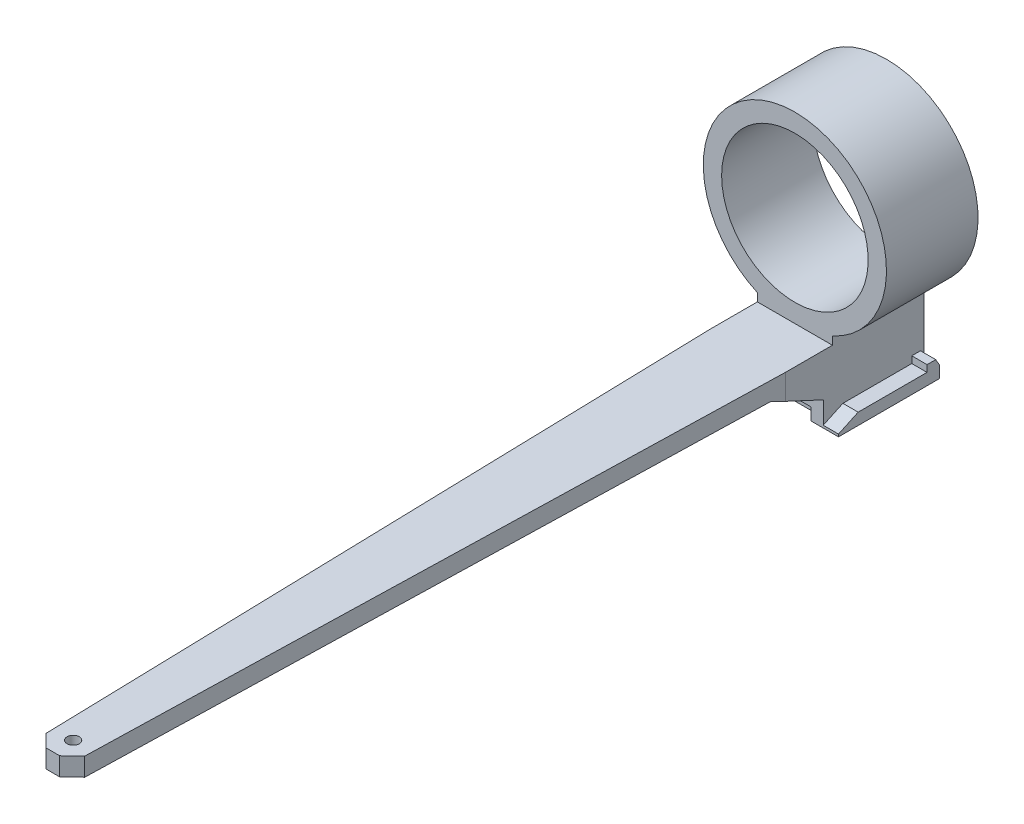
ISO-10303-21;
HEADER;
FILE_DESCRIPTION(('STEP AP214'),'2;1');
FILE_NAME('part.step','',(''),(''),'','','');
FILE_SCHEMA(('AUTOMOTIVE_DESIGN { 1 0 10303 214 1 1 1 1 }'));
ENDSEC;
DATA;
#1=APPLICATION_CONTEXT('core data for automotive mechanical design processes');
#2=APPLICATION_PROTOCOL_DEFINITION('international standard','automotive_design',2000,#1);
#3=PRODUCT_CONTEXT('',#1,'mechanical');
#4=PRODUCT('Part','Part','',(#3));
#5=PRODUCT_RELATED_PRODUCT_CATEGORY('part','',(#4));
#6=PRODUCT_DEFINITION_FORMATION('','',#4);
#7=PRODUCT_DEFINITION_CONTEXT('part definition',#1,'design');
#8=PRODUCT_DEFINITION('design','',#6,#7);
#9=PRODUCT_DEFINITION_SHAPE('','',#8);
#10=(LENGTH_UNIT() NAMED_UNIT(*) SI_UNIT(.MILLI.,.METRE.));
#11=(NAMED_UNIT(*) PLANE_ANGLE_UNIT() SI_UNIT($,.RADIAN.));
#12=(NAMED_UNIT(*) SI_UNIT($,.STERADIAN.) SOLID_ANGLE_UNIT());
#13=UNCERTAINTY_MEASURE_WITH_UNIT(LENGTH_MEASURE(1.E-05),#10,'distance_accuracy_value','');
#14=(GEOMETRIC_REPRESENTATION_CONTEXT(3) GLOBAL_UNCERTAINTY_ASSIGNED_CONTEXT((#13)) GLOBAL_UNIT_ASSIGNED_CONTEXT((#10,
#11,#12)) REPRESENTATION_CONTEXT('',''));
#15=CARTESIAN_POINT('',(0.,0.,0.));
#16=DIRECTION('',(0.,0.,1.));
#17=DIRECTION('',(1.,0.,0.));
#18=AXIS2_PLACEMENT_3D('',#15,#16,#17);
#19=CARTESIAN_POINT('',(0.,3.,-15.1420124759084));
#20=DIRECTION('',(0.,0.499999999999998,-0.86602540378444));
#21=DIRECTION('',(1.,0.,0.));
#22=AXIS2_PLACEMENT_3D('',#19,#20,#21);
#23=PLANE('',#22);
#24=DIRECTION('',(0.,0.86602540378444,0.499999999999998));
#25=VECTOR('',#24,1.);
#26=CARTESIAN_POINT('',(-14.0065823958615,3.,-15.1420124759084));
#27=LINE('',#26,#25);
#28=CARTESIAN_POINT('',(-14.0065823958615,2.,-15.719362745098));
#29=VERTEX_POINT('',#28);
#30=CARTESIAN_POINT('',(-14.0065823958615,3.,-15.1420124759084));
#31=VERTEX_POINT('',#30);
#32=EDGE_CURVE('E392',#29,#31,#27,.T.);
#33=ORIENTED_EDGE('',*,*,#32,.F.);
#34=DIRECTION('',(1.,0.,0.));
#35=VECTOR('',#34,1.);
#36=CARTESIAN_POINT('',(0.786356209150324,2.,-15.719362745098));
#37=LINE('',#36,#35);
#38=CARTESIAN_POINT('',(-16.7136437908497,2.,-15.719362745098));
#39=VERTEX_POINT('',#38);
#40=EDGE_CURVE('E432',#39,#29,#37,.T.);
#41=ORIENTED_EDGE('',*,*,#40,.F.);
#42=DIRECTION('',(0.,-0.86602540378444,-0.499999999999998));
#43=VECTOR('',#42,1.);
#44=CARTESIAN_POINT('',(-16.7136437908497,3.,-15.1420124759084));
#45=LINE('',#44,#43);
#46=CARTESIAN_POINT('',(-16.7136437908497,3.,-15.1420124759084));
#47=VERTEX_POINT('',#46);
#48=EDGE_CURVE('E514',#47,#39,#45,.T.);
#49=ORIENTED_EDGE('',*,*,#48,.F.);
#50=DIRECTION('',(-1.,0.,0.));
#51=VECTOR('',#50,1.);
#52=CARTESIAN_POINT('',(-16.7136437908497,3.,-15.1420124759084));
#53=LINE('',#52,#51);
#54=EDGE_CURVE('E436',#31,#47,#53,.T.);
#55=ORIENTED_EDGE('',*,*,#54,.F.);
#56=EDGE_LOOP('',(#33,#41,#49,#55));
#57=FACE_BOUND('',#56,.T.);
#58=ADVANCED_FACE('F33',(#57),#23,.T.);
#59=CARTESIAN_POINT('',(-16.7136437908497,3.,0.780637254901961));
#60=DIRECTION('',(0.,0.,-1.));
#61=DIRECTION('',(-1.,0.,0.));
#62=AXIS2_PLACEMENT_3D('',#59,#60,#61);
#63=PLANE('',#62);
#64=DIRECTION('',(1.,0.,0.));
#65=VECTOR('',#64,1.);
#66=CARTESIAN_POINT('',(-16.7136437908497,0.,0.780637254901961));
#67=LINE('',#66,#65);
#68=CARTESIAN_POINT('',(-16.7136437908497,0.,0.780637254901961));
#69=VERTEX_POINT('',#68);
#70=CARTESIAN_POINT('',(-12.0065823958615,0.,0.780637254901961));
#71=VERTEX_POINT('',#70);
#72=EDGE_CURVE('E478',#69,#71,#67,.T.);
#73=ORIENTED_EDGE('',*,*,#72,.T.);
#74=DIRECTION('',(0.,-1.,0.));
#75=VECTOR('',#74,1.);
#76=CARTESIAN_POINT('',(-12.0065823958615,0.,0.780637254901961));
#77=LINE('',#76,#75);
#78=CARTESIAN_POINT('',(-12.0065823958615,2.,0.780637254901961));
#79=VERTEX_POINT('',#78);
#80=EDGE_CURVE('E904',#79,#71,#77,.T.);
#81=ORIENTED_EDGE('',*,*,#80,.F.);
#82=DIRECTION('',(-1.,0.,0.));
#83=VECTOR('',#82,1.);
#84=CARTESIAN_POINT('',(-12.0065823958615,2.,0.780637254901961));
#85=LINE('',#84,#83);
#86=CARTESIAN_POINT('',(-3.71364379084967,2.,0.780637254901961));
#87=VERTEX_POINT('',#86);
#88=EDGE_CURVE('E900',#87,#79,#85,.T.);
#89=ORIENTED_EDGE('',*,*,#88,.F.);
#90=DIRECTION('',(0.,1.,0.));
#91=VECTOR('',#90,1.);
#92=CARTESIAN_POINT('',(-3.71364379084967,0.,0.780637254901961));
#93=LINE('',#92,#91);
#94=CARTESIAN_POINT('',(-3.71364379084967,0.,0.780637254901961));
#95=VERTEX_POINT('',#94);
#96=EDGE_CURVE('E902',#95,#87,#93,.T.);
#97=ORIENTED_EDGE('',*,*,#96,.F.);
#98=CARTESIAN_POINT('',(0.786356209150326,0.,0.780637254901961));
#99=VERTEX_POINT('',#98);
#100=EDGE_CURVE('E245',#95,#99,#67,.T.);
#101=ORIENTED_EDGE('',*,*,#100,.T.);
#102=DIRECTION('',(0.,-1.,0.));
#103=VECTOR('',#102,1.);
#104=CARTESIAN_POINT('',(0.786356209150326,3.,0.780637254901961));
#105=LINE('',#104,#103);
#106=CARTESIAN_POINT('',(0.786356209150326,0.399999999999995,0.780637254901961));
#107=VERTEX_POINT('',#106);
#108=EDGE_CURVE('E489',#107,#99,#105,.T.);
#109=ORIENTED_EDGE('',*,*,#108,.F.);
#110=DIRECTION('',(-1.,0.,0.));
#111=VECTOR('',#110,1.);
#112=CARTESIAN_POINT('',(-16.7136437908497,0.399999999999994,0.780637254901961));
#113=LINE('',#112,#111);
#114=CARTESIAN_POINT('',(-1.71364379084967,0.399999999999995,0.780637254901961));
#115=VERTEX_POINT('',#114);
#116=EDGE_CURVE('E501',#107,#115,#113,.T.);
#117=ORIENTED_EDGE('',*,*,#116,.T.);
#118=DIRECTION('',(0.,-1.,0.));
#119=VECTOR('',#118,1.);
#120=CARTESIAN_POINT('',(-1.71364379084967,3.,0.780637254901961));
#121=LINE('',#120,#119);
#122=CARTESIAN_POINT('',(-1.71364379084967,4.,0.780637254901961));
#123=VERTEX_POINT('',#122);
#124=EDGE_CURVE('E312',#123,#115,#121,.T.);
#125=ORIENTED_EDGE('',*,*,#124,.F.);
#126=DIRECTION('',(-1.,0.,0.));
#127=VECTOR('',#126,1.);
#128=CARTESIAN_POINT('',(-14.0065823958615,4.,0.780637254901961));
#129=LINE('',#128,#127);
#130=CARTESIAN_POINT('',(-14.0065823958615,4.,0.780637254901961));
#131=VERTEX_POINT('',#130);
#132=EDGE_CURVE('E343',#123,#131,#129,.T.);
#133=ORIENTED_EDGE('',*,*,#132,.T.);
#134=DIRECTION('',(0.,1.,0.));
#135=VECTOR('',#134,1.);
#136=CARTESIAN_POINT('',(-14.0065823958615,3.,0.780637254901961));
#137=LINE('',#136,#135);
#138=CARTESIAN_POINT('',(-14.0065823958615,0.399999999999996,0.780637254901961));
#139=VERTEX_POINT('',#138);
#140=EDGE_CURVE('E354',#139,#131,#137,.T.);
#141=ORIENTED_EDGE('',*,*,#140,.F.);
#142=DIRECTION('',(-1.,0.,0.));
#143=VECTOR('',#142,1.);
#144=CARTESIAN_POINT('',(-16.7136437908497,0.399999999999996,0.780637254901961));
#145=LINE('',#144,#143);
#146=CARTESIAN_POINT('',(-16.7136437908497,0.399999999999995,0.780637254901961));
#147=VERTEX_POINT('',#146);
#148=EDGE_CURVE('E499',#139,#147,#145,.T.);
#149=ORIENTED_EDGE('',*,*,#148,.T.);
#150=DIRECTION('',(0.,-1.,0.));
#151=VECTOR('',#150,1.);
#152=CARTESIAN_POINT('',(-16.7136437908497,3.,0.780637254901961));
#153=LINE('',#152,#151);
#154=EDGE_CURVE('E492',#147,#69,#153,.T.);
#155=ORIENTED_EDGE('',*,*,#154,.T.);
#156=EDGE_LOOP('',(#73,#81,#89,#97,#101,#109,#117,#125,#133,#141,#149,#155));
#157=FACE_BOUND('',#156,.T.);
#158=ADVANCED_FACE('F568',(#157),#63,.F.);
#159=CARTESIAN_POINT('',(0.,3.,0.));
#160=DIRECTION('',(0.,1.,0.));
#161=DIRECTION('',(0.,0.,1.));
#162=AXIS2_PLACEMENT_3D('',#159,#160,#161);
#163=PLANE('',#162);
#164=DIRECTION('',(0.,0.,1.));
#165=VECTOR('',#164,1.);
#166=CARTESIAN_POINT('',(-14.0065823958615,3.,0.780637254901961));
#167=LINE('',#166,#165);
#168=CARTESIAN_POINT('',(-14.0065823958615,3.,-13.719362745098));
#169=VERTEX_POINT('',#168);
#170=EDGE_CURVE('E322',#31,#169,#167,.T.);
#171=ORIENTED_EDGE('',*,*,#170,.F.);
#172=ORIENTED_EDGE('',*,*,#54,.T.);
#173=DIRECTION('',(0.,0.,1.));
#174=VECTOR('',#173,1.);
#175=CARTESIAN_POINT('',(-16.7136437908497,3.,-15.719362745098));
#176=LINE('',#175,#174);
#177=CARTESIAN_POINT('',(-16.7136437908497,3.,-13.719362745098));
#178=VERTEX_POINT('',#177);
#179=EDGE_CURVE('E469',#47,#178,#176,.T.);
#180=ORIENTED_EDGE('',*,*,#179,.T.);
#181=DIRECTION('',(-1.,0.,0.));
#182=VECTOR('',#181,1.);
#183=CARTESIAN_POINT('',(-16.7136437908497,3.,-13.719362745098));
#184=LINE('',#183,#182);
#185=EDGE_CURVE('E449',#169,#178,#184,.T.);
#186=ORIENTED_EDGE('',*,*,#185,.F.);
#187=EDGE_LOOP('',(#171,#172,#180,#186));
#188=FACE_BOUND('',#187,.T.);
#189=ADVANCED_FACE('F543',(#188),#163,.T.);
#190=CARTESIAN_POINT('',(-16.7136437908497,3.,-15.719362745098));
#191=DIRECTION('',(1.,0.,0.));
#192=DIRECTION('',(0.,0.,-1.));
#193=AXIS2_PLACEMENT_3D('',#190,#191,#192);
#194=PLANE('',#193);
#195=ORIENTED_EDGE('',*,*,#179,.F.);
#196=ORIENTED_EDGE('',*,*,#48,.T.);
#197=DIRECTION('',(0.,-1.,0.));
#198=VECTOR('',#197,1.);
#199=CARTESIAN_POINT('',(-16.7136437908497,3.,-15.719362745098));
#200=LINE('',#199,#198);
#201=CARTESIAN_POINT('',(-16.7136437908497,0.,-15.719362745098));
#202=VERTEX_POINT('',#201);
#203=EDGE_CURVE('E475',#39,#202,#200,.T.);
#204=ORIENTED_EDGE('',*,*,#203,.T.);
#205=DIRECTION('',(0.,0.,1.));
#206=VECTOR('',#205,1.);
#207=CARTESIAN_POINT('',(-16.7136437908497,0.,-15.719362745098));
#208=LINE('',#207,#206);
#209=EDGE_CURVE('E466',#202,#69,#208,.T.);
#210=ORIENTED_EDGE('',*,*,#209,.T.);
#211=ORIENTED_EDGE('',*,*,#154,.F.);
#212=DIRECTION('',(0.,-0.4226182617407,0.90630778703665));
#213=VECTOR('',#212,1.);
#214=CARTESIAN_POINT('',(-16.7136437908497,1.9,-2.43612312586238));
#215=LINE('',#214,#213);
#216=CARTESIAN_POINT('',(-16.7136437908497,1.9,-2.43612312586238));
#217=VERTEX_POINT('',#216);
#218=EDGE_CURVE('E507',#147,#217,#215,.F.);
#219=ORIENTED_EDGE('',*,*,#218,.T.);
#220=DIRECTION('',(0.,0.,1.));
#221=VECTOR('',#220,1.);
#222=CARTESIAN_POINT('',(-16.7136437908497,1.9,-13.719362745098));
#223=LINE('',#222,#221);
#224=CARTESIAN_POINT('',(-16.7136437908497,1.9,-13.719362745098));
#225=VERTEX_POINT('',#224);
#226=EDGE_CURVE('E455',#225,#217,#223,.T.);
#227=ORIENTED_EDGE('',*,*,#226,.F.);
#228=DIRECTION('',(0.,-1.,0.));
#229=VECTOR('',#228,1.);
#230=CARTESIAN_POINT('',(-16.7136437908497,3.,-13.719362745098));
#231=LINE('',#230,#229);
#232=EDGE_CURVE('E458',#178,#225,#231,.T.);
#233=ORIENTED_EDGE('',*,*,#232,.F.);
#234=EDGE_LOOP('',(#195,#196,#204,#210,#211,#219,#227,#233));
#235=FACE_BOUND('',#234,.T.);
#236=ADVANCED_FACE('F530',(#235),#194,.F.);
#237=CARTESIAN_POINT('',(0.786356209150324,3.,-15.719362745098));
#238=DIRECTION('',(-1.,0.,0.));
#239=DIRECTION('',(0.,0.,1.));
#240=AXIS2_PLACEMENT_3D('',#237,#238,#239);
#241=PLANE('',#240);
#242=DIRECTION('',(0.,-1.,0.));
#243=VECTOR('',#242,1.);
#244=CARTESIAN_POINT('',(0.786356209150324,3.,-15.719362745098));
#245=LINE('',#244,#243);
#246=CARTESIAN_POINT('',(0.786356209150324,2.,-15.719362745098));
#247=VERTEX_POINT('',#246);
#248=CARTESIAN_POINT('',(0.786356209150324,0.,-15.719362745098));
#249=VERTEX_POINT('',#248);
#250=EDGE_CURVE('E487',#247,#249,#245,.T.);
#251=ORIENTED_EDGE('',*,*,#250,.F.);
#252=DIRECTION('',(0.,0.86602540378444,0.499999999999998));
#253=VECTOR('',#252,1.);
#254=CARTESIAN_POINT('',(0.786356209150324,3.,-15.1420124759084));
#255=LINE('',#254,#253);
#256=CARTESIAN_POINT('',(0.786356209150324,3.,-15.1420124759084));
#257=VERTEX_POINT('',#256);
#258=EDGE_CURVE('E429',#247,#257,#255,.T.);
#259=ORIENTED_EDGE('',*,*,#258,.T.);
#260=DIRECTION('',(0.,0.,-1.));
#261=VECTOR('',#260,1.);
#262=CARTESIAN_POINT('',(0.786356209150324,3.,-15.719362745098));
#263=LINE('',#262,#261);
#264=CARTESIAN_POINT('',(0.786356209150324,3.,-13.719362745098));
#265=VERTEX_POINT('',#264);
#266=EDGE_CURVE('E471',#265,#257,#263,.T.);
#267=ORIENTED_EDGE('',*,*,#266,.F.);
#268=DIRECTION('',(0.,1.,0.));
#269=VECTOR('',#268,1.);
#270=CARTESIAN_POINT('',(0.786356209150326,3.,-13.719362745098));
#271=LINE('',#270,#269);
#272=CARTESIAN_POINT('',(0.786356209150326,1.9,-13.719362745098));
#273=VERTEX_POINT('',#272);
#274=EDGE_CURVE('E326',#273,#265,#271,.T.);
#275=ORIENTED_EDGE('',*,*,#274,.F.);
#276=DIRECTION('',(0.,0.,1.));
#277=VECTOR('',#276,1.);
#278=CARTESIAN_POINT('',(0.786356209150326,1.9,-13.719362745098));
#279=LINE('',#278,#277);
#280=CARTESIAN_POINT('',(0.786356209150326,1.9,-2.43612312586239));
#281=VERTEX_POINT('',#280);
#282=EDGE_CURVE('E336',#273,#281,#279,.T.);
#283=ORIENTED_EDGE('',*,*,#282,.T.);
#284=DIRECTION('',(0.,0.4226182617407,-0.90630778703665));
#285=VECTOR('',#284,1.);
#286=CARTESIAN_POINT('',(0.786356209150326,1.9,-2.43612312586238));
#287=LINE('',#286,#285);
#288=EDGE_CURVE('E497',#281,#107,#287,.F.);
#289=ORIENTED_EDGE('',*,*,#288,.T.);
#290=ORIENTED_EDGE('',*,*,#108,.T.);
#291=DIRECTION('',(0.,0.,-1.));
#292=VECTOR('',#291,1.);
#293=CARTESIAN_POINT('',(0.786356209150324,0.,-15.719362745098));
#294=LINE('',#293,#292);
#295=EDGE_CURVE('E481',#99,#249,#294,.T.);
#296=ORIENTED_EDGE('',*,*,#295,.T.);
#297=EDGE_LOOP('',(#251,#259,#267,#275,#283,#289,#290,#296));
#298=FACE_BOUND('',#297,.T.);
#299=ADVANCED_FACE('F556',(#298),#241,.F.);
#300=CARTESIAN_POINT('',(-16.7136437908497,3.,-15.719362745098));
#301=DIRECTION('',(0.,0.,1.));
#302=DIRECTION('',(1.,0.,0.));
#303=AXIS2_PLACEMENT_3D('',#300,#301,#302);
#304=PLANE('',#303);
#305=DIRECTION('',(0.,1.,0.));
#306=VECTOR('',#305,1.);
#307=CARTESIAN_POINT('',(-1.71364379084967,0.999999999999989,-15.719362745098));
#308=LINE('',#307,#306);
#309=CARTESIAN_POINT('',(-1.71364379084967,2.,-15.719362745098));
#310=VERTEX_POINT('',#309);
#311=CARTESIAN_POINT('',(-1.71364379084967,12.3171305964958,-15.719362745098));
#312=VERTEX_POINT('',#311);
#313=EDGE_CURVE('E384',#310,#312,#308,.T.);
#314=ORIENTED_EDGE('',*,*,#313,.F.);
#315=EDGE_CURVE('E520',#310,#247,#37,.T.);
#316=ORIENTED_EDGE('',*,*,#315,.T.);
#317=ORIENTED_EDGE('',*,*,#250,.T.);
#318=DIRECTION('',(-1.,0.,0.));
#319=VECTOR('',#318,1.);
#320=CARTESIAN_POINT('',(-16.7136437908497,0.,-15.719362745098));
#321=LINE('',#320,#319);
#322=EDGE_CURVE('E472',#249,#202,#321,.T.);
#323=ORIENTED_EDGE('',*,*,#322,.T.);
#324=ORIENTED_EDGE('',*,*,#203,.F.);
#325=ORIENTED_EDGE('',*,*,#40,.T.);
#326=DIRECTION('',(0.,1.,0.));
#327=VECTOR('',#326,1.);
#328=CARTESIAN_POINT('',(-14.0065823958615,0.999999999999989,-15.719362745098));
#329=LINE('',#328,#327);
#330=CARTESIAN_POINT('',(-14.0065823958615,12.3171305964958,-15.719362745098));
#331=VERTEX_POINT('',#330);
#332=EDGE_CURVE('E387',#29,#331,#329,.T.);
#333=ORIENTED_EDGE('',*,*,#332,.T.);
#334=CARTESIAN_POINT('',(-7.86011309335561,26.,-15.719362745098));
#335=DIRECTION('',(0.,0.,-1.));
#336=DIRECTION('',(-1.,0.,0.));
#337=AXIS2_PLACEMENT_3D('',#334,#335,#336);
#338=CIRCLE('',#337,15.);
#339=EDGE_CURVE('E276',#331,#312,#338,.T.);
#340=ORIENTED_EDGE('',*,*,#339,.T.);
#341=EDGE_LOOP('',(#314,#316,#317,#323,#324,#325,#333,#340));
#342=FACE_BOUND('',#341,.T.);
#343=CARTESIAN_POINT('',(-7.86011309335561,26.,-15.719362745098));
#344=DIRECTION('',(0.,0.,-1.));
#345=DIRECTION('',(-1.,0.,0.));
#346=AXIS2_PLACEMENT_3D('',#343,#344,#345);
#347=CIRCLE('',#346,12.);
#348=CARTESIAN_POINT('',(-19.8601130933556,26.,-15.719362745098));
#349=VERTEX_POINT('',#348);
#350=EDGE_CURVE('E272',#349,#349,#347,.T.);
#351=ORIENTED_EDGE('',*,*,#350,.F.);
#352=EDGE_LOOP('',(#351));
#353=FACE_BOUND('',#352,.T.);
#354=ADVANCED_FACE('F534',(#342,#353),#304,.F.);
#355=DIRECTION('',(0.,0.,-1.));
#356=VECTOR('',#355,1.);
#357=CARTESIAN_POINT('',(-1.71364379084967,3.,0.780637254901961));
#358=LINE('',#357,#356);
#359=CARTESIAN_POINT('',(-1.71364379084967,3.,-13.719362745098));
#360=VERTEX_POINT('',#359);
#361=CARTESIAN_POINT('',(-1.71364379084967,3.,-15.1420124759084));
#362=VERTEX_POINT('',#361);
#363=EDGE_CURVE('E427',#360,#362,#358,.T.);
#364=ORIENTED_EDGE('',*,*,#363,.F.);
#365=DIRECTION('',(-1.,0.,0.));
#366=VECTOR('',#365,1.);
#367=CARTESIAN_POINT('',(0.786356209150326,3.,-13.719362745098));
#368=LINE('',#367,#366);
#369=EDGE_CURVE('E328',#265,#360,#368,.T.);
#370=ORIENTED_EDGE('',*,*,#369,.F.);
#371=ORIENTED_EDGE('',*,*,#266,.T.);
#372=EDGE_CURVE('E517',#257,#362,#53,.T.);
#373=ORIENTED_EDGE('',*,*,#372,.T.);
#374=EDGE_LOOP('',(#364,#370,#371,#373));
#375=FACE_BOUND('',#374,.T.);
#376=ADVANCED_FACE('F607',(#375),#163,.T.);
#377=CARTESIAN_POINT('',(0.,0.,0.));
#378=DIRECTION('',(0.,1.,0.));
#379=DIRECTION('',(0.,0.,1.));
#380=AXIS2_PLACEMENT_3D('',#377,#378,#379);
#381=PLANE('',#380);
#382=DIRECTION('',(1.,0.,0.));
#383=VECTOR('',#382,1.);
#384=CARTESIAN_POINT('',(-12.0065823958615,0.,-0.719362745098039));
#385=LINE('',#384,#383);
#386=CARTESIAN_POINT('',(-12.0065823958615,0.,-0.719362745098039));
#387=VERTEX_POINT('',#386);
#388=CARTESIAN_POINT('',(-3.71364379084967,0.,-0.719362745098039));
#389=VERTEX_POINT('',#388);
#390=EDGE_CURVE('E235',#387,#389,#385,.T.);
#391=ORIENTED_EDGE('',*,*,#390,.F.);
#392=DIRECTION('',(0.,0.,1.));
#393=VECTOR('',#392,1.);
#394=CARTESIAN_POINT('',(-12.0065823958615,0.,-0.719362745098039));
#395=LINE('',#394,#393);
#396=EDGE_CURVE('E246',#387,#71,#395,.T.);
#397=ORIENTED_EDGE('',*,*,#396,.T.);
#398=ORIENTED_EDGE('',*,*,#72,.F.);
#399=ORIENTED_EDGE('',*,*,#209,.F.);
#400=ORIENTED_EDGE('',*,*,#322,.F.);
#401=ORIENTED_EDGE('',*,*,#295,.F.);
#402=ORIENTED_EDGE('',*,*,#100,.F.);
#403=DIRECTION('',(0.,0.,1.));
#404=VECTOR('',#403,1.);
#405=CARTESIAN_POINT('',(-3.71364379084967,0.,-0.719362745098039));
#406=LINE('',#405,#404);
#407=EDGE_CURVE('E230',#389,#95,#406,.T.);
#408=ORIENTED_EDGE('',*,*,#407,.F.);
#409=EDGE_LOOP('',(#391,#397,#398,#399,#400,#401,#402,#408));
#410=FACE_BOUND('',#409,.T.);
#411=ADVANCED_FACE('F243',(#410),#381,.F.);
#412=CARTESIAN_POINT('',(-14.0065823958615,3.,-13.719362745098));
#413=DIRECTION('',(1.,0.,0.));
#414=DIRECTION('',(0.,0.,-1.));
#415=AXIS2_PLACEMENT_3D('',#412,#413,#414);
#416=PLANE('',#415);
#417=DIRECTION('',(0.,-0.422618261740694,-0.906307787036652));
#418=VECTOR('',#417,1.);
#419=CARTESIAN_POINT('',(-14.0065823958615,-1.73242840776926,-11.512595136885));
#420=LINE('',#419,#418);
#421=CARTESIAN_POINT('',(-14.0065823958614,6.88024302531556,6.95733835544066));
#422=VERTEX_POINT('',#421);
#423=EDGE_CURVE('E305',#131,#422,#420,.F.);
#424=ORIENTED_EDGE('',*,*,#423,.T.);
#425=DIRECTION('',(0.,1.,0.));
#426=VECTOR('',#425,1.);
#427=CARTESIAN_POINT('',(-14.0065823958615,-4.,6.95733835543176));
#428=LINE('',#427,#426);
#429=CARTESIAN_POINT('',(-14.0065823958615,11.,6.95733835543176));
#430=VERTEX_POINT('',#429);
#431=EDGE_CURVE('E267',#422,#430,#428,.T.);
#432=ORIENTED_EDGE('',*,*,#431,.T.);
#433=DIRECTION('',(0.,0.,1.));
#434=VECTOR('',#433,1.);
#435=CARTESIAN_POINT('',(-14.0065823958615,11.,0.780637254901961));
#436=LINE('',#435,#434);
#437=CARTESIAN_POINT('',(-14.0065823958615,11.,-0.71936274509804));
#438=VERTEX_POINT('',#437);
#439=EDGE_CURVE('E290',#438,#430,#436,.T.);
#440=ORIENTED_EDGE('',*,*,#439,.F.);
#441=DIRECTION('',(0.,1.,0.));
#442=VECTOR('',#441,1.);
#443=CARTESIAN_POINT('',(-14.0065823958615,11.,-0.71936274509804));
#444=LINE('',#443,#442);
#445=CARTESIAN_POINT('',(-14.0065823958615,12.3171305964958,-0.71936274509804));
#446=VERTEX_POINT('',#445);
#447=EDGE_CURVE('E288',#438,#446,#444,.T.);
#448=ORIENTED_EDGE('',*,*,#447,.T.);
#449=DIRECTION('',(0.,0.,-1.));
#450=VECTOR('',#449,1.);
#451=CARTESIAN_POINT('',(-14.0065823958615,12.3171305964958,-0.71936274509804));
#452=LINE('',#451,#450);
#453=EDGE_CURVE('E374',#446,#331,#452,.T.);
#454=ORIENTED_EDGE('',*,*,#453,.T.);
#455=ORIENTED_EDGE('',*,*,#332,.F.);
#456=ORIENTED_EDGE('',*,*,#32,.T.);
#457=ORIENTED_EDGE('',*,*,#170,.T.);
#458=DIRECTION('',(0.,1.,0.));
#459=VECTOR('',#458,1.);
#460=CARTESIAN_POINT('',(-14.0065823958615,3.,-13.719362745098));
#461=LINE('',#460,#459);
#462=CARTESIAN_POINT('',(-14.0065823958615,1.9,-13.719362745098));
#463=VERTEX_POINT('',#462);
#464=EDGE_CURVE('E447',#463,#169,#461,.T.);
#465=ORIENTED_EDGE('',*,*,#464,.F.);
#466=DIRECTION('',(0.,0.,1.));
#467=VECTOR('',#466,1.);
#468=CARTESIAN_POINT('',(-14.0065823958615,1.9,-13.719362745098));
#469=LINE('',#468,#467);
#470=CARTESIAN_POINT('',(-14.0065823958615,1.9,-2.43612312586238));
#471=VERTEX_POINT('',#470);
#472=EDGE_CURVE('E463',#463,#471,#469,.T.);
#473=ORIENTED_EDGE('',*,*,#472,.T.);
#474=DIRECTION('',(0.,0.4226182617407,-0.90630778703665));
#475=VECTOR('',#474,1.);
#476=CARTESIAN_POINT('',(-14.0065823958615,6.4181983200201,-12.1254306913801));
#477=LINE('',#476,#475);
#478=EDGE_CURVE('E511',#471,#139,#477,.F.);
#479=ORIENTED_EDGE('',*,*,#478,.T.);
#480=ORIENTED_EDGE('',*,*,#140,.T.);
#481=EDGE_LOOP('',(#424,#432,#440,#448,#454,#455,#456,#457,#465,#473,#479,#480));
#482=FACE_BOUND('',#481,.T.);
#483=ADVANCED_FACE('F350',(#482),#416,.F.);
#484=CARTESIAN_POINT('',(-16.7136437908497,1.9,-13.719362745098));
#485=DIRECTION('',(0.,-1.,0.));
#486=DIRECTION('',(0.,0.,-1.));
#487=AXIS2_PLACEMENT_3D('',#484,#485,#486);
#488=PLANE('',#487);
#489=ORIENTED_EDGE('',*,*,#226,.T.);
#490=DIRECTION('',(1.,0.,0.));
#491=VECTOR('',#490,1.);
#492=CARTESIAN_POINT('',(-16.7136437908497,1.9,-2.43612312586238));
#493=LINE('',#492,#491);
#494=EDGE_CURVE('E504',#217,#471,#493,.T.);
#495=ORIENTED_EDGE('',*,*,#494,.T.);
#496=ORIENTED_EDGE('',*,*,#472,.F.);
#497=DIRECTION('',(1.,0.,0.));
#498=VECTOR('',#497,1.);
#499=CARTESIAN_POINT('',(-16.7136437908497,1.9,-13.719362745098));
#500=LINE('',#499,#498);
#501=EDGE_CURVE('E450',#225,#463,#500,.T.);
#502=ORIENTED_EDGE('',*,*,#501,.F.);
#503=EDGE_LOOP('',(#489,#495,#496,#502));
#504=FACE_BOUND('',#503,.T.);
#505=ADVANCED_FACE('F577',(#504),#488,.F.);
#506=CARTESIAN_POINT('',(0.,0.,-13.719362745098));
#507=DIRECTION('',(0.,0.,1.));
#508=DIRECTION('',(1.,0.,0.));
#509=AXIS2_PLACEMENT_3D('',#506,#507,#508);
#510=PLANE('',#509);
#511=ORIENTED_EDGE('',*,*,#232,.T.);
#512=ORIENTED_EDGE('',*,*,#501,.T.);
#513=ORIENTED_EDGE('',*,*,#464,.T.);
#514=ORIENTED_EDGE('',*,*,#185,.T.);
#515=EDGE_LOOP('',(#511,#512,#513,#514));
#516=FACE_BOUND('',#515,.T.);
#517=ADVANCED_FACE('F546',(#516),#510,.T.);
#518=CARTESIAN_POINT('',(0.786356209150326,1.9,-13.719362745098));
#519=DIRECTION('',(0.,-1.,0.));
#520=DIRECTION('',(1.,0.,0.));
#521=AXIS2_PLACEMENT_3D('',#518,#519,#520);
#522=PLANE('',#521);
#523=DIRECTION('',(0.,0.,1.));
#524=VECTOR('',#523,1.);
#525=CARTESIAN_POINT('',(-1.71364379084967,1.9,-13.719362745098));
#526=LINE('',#525,#524);
#527=CARTESIAN_POINT('',(-1.71364379084967,1.9,-13.719362745098));
#528=VERTEX_POINT('',#527);
#529=CARTESIAN_POINT('',(-1.71364379084967,1.9,-2.43612312586238));
#530=VERTEX_POINT('',#529);
#531=EDGE_CURVE('E332',#528,#530,#526,.T.);
#532=ORIENTED_EDGE('',*,*,#531,.T.);
#533=DIRECTION('',(1.,0.,0.));
#534=VECTOR('',#533,1.);
#535=CARTESIAN_POINT('',(0.786356209150326,1.9,-2.43612312586238));
#536=LINE('',#535,#534);
#537=EDGE_CURVE('E494',#530,#281,#536,.T.);
#538=ORIENTED_EDGE('',*,*,#537,.T.);
#539=ORIENTED_EDGE('',*,*,#282,.F.);
#540=DIRECTION('',(1.,0.,0.));
#541=VECTOR('',#540,1.);
#542=CARTESIAN_POINT('',(0.786356209150326,1.9,-13.719362745098));
#543=LINE('',#542,#541);
#544=EDGE_CURVE('E329',#528,#273,#543,.T.);
#545=ORIENTED_EDGE('',*,*,#544,.F.);
#546=EDGE_LOOP('',(#532,#538,#539,#545));
#547=FACE_BOUND('',#546,.T.);
#548=ADVANCED_FACE('F559',(#547),#522,.F.);
#549=CARTESIAN_POINT('',(-1.71364379084967,3.,-13.719362745098));
#550=DIRECTION('',(-1.,0.,0.));
#551=DIRECTION('',(0.,-1.,0.));
#552=AXIS2_PLACEMENT_3D('',#549,#550,#551);
#553=PLANE('',#552);
#554=DIRECTION('',(0.,0.,-1.));
#555=VECTOR('',#554,1.);
#556=CARTESIAN_POINT('',(-1.71364379084967,11.,0.780637254901961));
#557=LINE('',#556,#555);
#558=CARTESIAN_POINT('',(-1.71364379084967,11.,6.95733835543176));
#559=VERTEX_POINT('',#558);
#560=CARTESIAN_POINT('',(-1.71364379084967,11.,-0.71936274509804));
#561=VERTEX_POINT('',#560);
#562=EDGE_CURVE('E309',#559,#561,#557,.T.);
#563=ORIENTED_EDGE('',*,*,#562,.F.);
#564=DIRECTION('',(0.,1.,0.));
#565=VECTOR('',#564,1.);
#566=CARTESIAN_POINT('',(-1.71364379084967,-4.,6.95733835543176));
#567=LINE('',#566,#565);
#568=CARTESIAN_POINT('',(-1.71364379084967,6.88024302531141,6.95733835543176));
#569=VERTEX_POINT('',#568);
#570=EDGE_CURVE('E260',#569,#559,#567,.T.);
#571=ORIENTED_EDGE('',*,*,#570,.F.);
#572=DIRECTION('',(0.,0.422618261740694,0.906307787036652));
#573=VECTOR('',#572,1.);
#574=CARTESIAN_POINT('',(-1.71364379084967,-1.73242840776926,-11.512595136885));
#575=LINE('',#574,#573);
#576=EDGE_CURVE('E345',#569,#123,#575,.F.);
#577=ORIENTED_EDGE('',*,*,#576,.T.);
#578=ORIENTED_EDGE('',*,*,#124,.T.);
#579=DIRECTION('',(0.,-0.4226182617407,0.906307787036649));
#580=VECTOR('',#579,1.);
#581=CARTESIAN_POINT('',(-1.71364379084967,6.4181983200201,-12.1254306913801));
#582=LINE('',#581,#580);
#583=EDGE_CURVE('E509',#115,#530,#582,.F.);
#584=ORIENTED_EDGE('',*,*,#583,.T.);
#585=ORIENTED_EDGE('',*,*,#531,.F.);
#586=DIRECTION('',(0.,-1.,0.));
#587=VECTOR('',#586,1.);
#588=CARTESIAN_POINT('',(-1.71364379084967,3.,-13.719362745098));
#589=LINE('',#588,#587);
#590=EDGE_CURVE('E333',#360,#528,#589,.T.);
#591=ORIENTED_EDGE('',*,*,#590,.F.);
#592=ORIENTED_EDGE('',*,*,#363,.T.);
#593=DIRECTION('',(0.,-0.86602540378444,-0.499999999999998));
#594=VECTOR('',#593,1.);
#595=CARTESIAN_POINT('',(-1.71364379084967,3.,-15.1420124759084));
#596=LINE('',#595,#594);
#597=EDGE_CURVE('E389',#362,#310,#596,.T.);
#598=ORIENTED_EDGE('',*,*,#597,.T.);
#599=ORIENTED_EDGE('',*,*,#313,.T.);
#600=DIRECTION('',(0.,0.,-1.));
#601=VECTOR('',#600,1.);
#602=CARTESIAN_POINT('',(-1.71364379084967,12.3171305964958,-0.71936274509804));
#603=LINE('',#602,#601);
#604=CARTESIAN_POINT('',(-1.71364379084967,12.3171305964958,-0.71936274509804));
#605=VERTEX_POINT('',#604);
#606=EDGE_CURVE('E382',#605,#312,#603,.T.);
#607=ORIENTED_EDGE('',*,*,#606,.F.);
#608=DIRECTION('',(0.,-1.,0.));
#609=VECTOR('',#608,1.);
#610=CARTESIAN_POINT('',(-1.71364379084967,11.,-0.71936274509804));
#611=LINE('',#610,#609);
#612=EDGE_CURVE('E289',#605,#561,#611,.T.);
#613=ORIENTED_EDGE('',*,*,#612,.T.);
#614=EDGE_LOOP('',(#563,#571,#577,#578,#584,#585,#591,#592,#598,#599,#607,#613));
#615=FACE_BOUND('',#614,.T.);
#616=ADVANCED_FACE('F425',(#615),#553,.F.);
#617=CARTESIAN_POINT('',(0.,0.,-13.719362745098));
#618=DIRECTION('',(0.,0.,-1.));
#619=DIRECTION('',(-1.,0.,0.));
#620=AXIS2_PLACEMENT_3D('',#617,#618,#619);
#621=PLANE('',#620);
#622=ORIENTED_EDGE('',*,*,#274,.T.);
#623=ORIENTED_EDGE('',*,*,#369,.T.);
#624=ORIENTED_EDGE('',*,*,#590,.T.);
#625=ORIENTED_EDGE('',*,*,#544,.T.);
#626=EDGE_LOOP('',(#622,#623,#624,#625));
#627=FACE_BOUND('',#626,.T.);
#628=ADVANCED_FACE('F561',(#627),#621,.F.);
#629=CARTESIAN_POINT('',(0.786356209150326,1.9,-2.43612312586238));
#630=DIRECTION('',(0.,-0.90630778703665,-0.4226182617407));
#631=DIRECTION('',(1.,0.,0.));
#632=AXIS2_PLACEMENT_3D('',#629,#630,#631);
#633=PLANE('',#632);
#634=ORIENTED_EDGE('',*,*,#583,.F.);
#635=ORIENTED_EDGE('',*,*,#116,.F.);
#636=ORIENTED_EDGE('',*,*,#288,.F.);
#637=ORIENTED_EDGE('',*,*,#537,.F.);
#638=EDGE_LOOP('',(#634,#635,#636,#637));
#639=FACE_BOUND('',#638,.T.);
#640=ADVANCED_FACE('F566',(#639),#633,.F.);
#641=CARTESIAN_POINT('',(-16.7136437908497,1.9,-2.43612312586238));
#642=DIRECTION('',(0.,-0.90630778703665,-0.4226182617407));
#643=DIRECTION('',(1.,0.,0.));
#644=AXIS2_PLACEMENT_3D('',#641,#642,#643);
#645=PLANE('',#644);
#646=ORIENTED_EDGE('',*,*,#218,.F.);
#647=ORIENTED_EDGE('',*,*,#148,.F.);
#648=ORIENTED_EDGE('',*,*,#478,.F.);
#649=ORIENTED_EDGE('',*,*,#494,.F.);
#650=EDGE_LOOP('',(#646,#647,#648,#649));
#651=FACE_BOUND('',#650,.T.);
#652=ADVANCED_FACE('F575',(#651),#645,.F.);
#653=ORIENTED_EDGE('',*,*,#597,.F.);
#654=ORIENTED_EDGE('',*,*,#372,.F.);
#655=ORIENTED_EDGE('',*,*,#258,.F.);
#656=ORIENTED_EDGE('',*,*,#315,.F.);
#657=EDGE_LOOP('',(#653,#654,#655,#656));
#658=FACE_BOUND('',#657,.T.);
#659=ADVANCED_FACE('F589',(#658),#23,.T.);
#660=CARTESIAN_POINT('',(0.,11.,0.));
#661=DIRECTION('',(0.,-1.,0.));
#662=DIRECTION('',(0.,0.,-1.));
#663=AXIS2_PLACEMENT_3D('',#660,#661,#662);
#664=PLANE('',#663);
#665=CARTESIAN_POINT('',(-7.86011309335561,11.,117.47893419863));
#666=DIRECTION('',(0.,1.,0.));
#667=DIRECTION('',(0.,0.,1.));
#668=AXIS2_PLACEMENT_3D('',#665,#666,#667);
#669=CIRCLE('',#668,1.);
#670=CARTESIAN_POINT('',(-7.86011309335561,11.,118.47893419863));
#671=VERTEX_POINT('',#670);
#672=EDGE_CURVE('E253',#671,#671,#669,.T.);
#673=ORIENTED_EDGE('',*,*,#672,.F.);
#674=EDGE_LOOP('',(#673));
#675=FACE_BOUND('',#674,.T.);
#676=DIRECTION('',(-1.,0.,0.));
#677=VECTOR('',#676,1.);
#678=CARTESIAN_POINT('',(-14.0065823958615,11.,120.780637254902));
#679=LINE('',#678,#677);
#680=CARTESIAN_POINT('',(-6.7684973844602,11.,120.780637254902));
#681=VERTEX_POINT('',#680);
#682=CARTESIAN_POINT('',(-9.00658239586154,11.,120.780637254902));
#683=VERTEX_POINT('',#682);
#684=EDGE_CURVE('E325',#681,#683,#679,.T.);
#685=ORIENTED_EDGE('',*,*,#684,.F.);
#686=DIRECTION('',(0.725491795954031,0.,-0.688230814482608));
#687=VECTOR('',#686,1.);
#688=CARTESIAN_POINT('',(-6.7684973844602,11.,120.780637254902));
#689=LINE('',#688,#687);
#690=CARTESIAN_POINT('',(-4.66094880550545,11.,118.781331565789));
#691=VERTEX_POINT('',#690);
#692=EDGE_CURVE('E410',#681,#691,#689,.T.);
#693=ORIENTED_EDGE('',*,*,#692,.T.);
#694=DIRECTION('',(-0.0263474926721127,0.,0.999652844556496));
#695=VECTOR('',#694,1.);
#696=CARTESIAN_POINT('',(-1.71364379084967,11.,6.95733835543176));
#697=LINE('',#696,#695);
#698=EDGE_CURVE('E257',#559,#691,#697,.T.);
#699=ORIENTED_EDGE('',*,*,#698,.F.);
#700=ORIENTED_EDGE('',*,*,#562,.T.);
#701=DIRECTION('',(-1.,0.,0.));
#702=VECTOR('',#701,1.);
#703=CARTESIAN_POINT('',(-1.71364379084967,11.,-0.71936274509804));
#704=LINE('',#703,#702);
#705=EDGE_CURVE('E284',#561,#438,#704,.T.);
#706=ORIENTED_EDGE('',*,*,#705,.T.);
#707=ORIENTED_EDGE('',*,*,#439,.T.);
#708=DIRECTION('',(-0.0263474926721127,0.,-0.999652844556496));
#709=VECTOR('',#708,1.);
#710=CARTESIAN_POINT('',(-11.0065823958615,11.,120.780637254902));
#711=LINE('',#710,#709);
#712=CARTESIAN_POINT('',(-11.0607226358615,11.,118.726497014902));
#713=VERTEX_POINT('',#712);
#714=EDGE_CURVE('E265',#713,#430,#711,.T.);
#715=ORIENTED_EDGE('',*,*,#714,.F.);
#716=DIRECTION('',(0.707106781186553,0.,0.707106781186542));
#717=VECTOR('',#716,1.);
#718=CARTESIAN_POINT('',(-11.0607226358615,11.,118.726497014902));
#719=LINE('',#718,#717);
#720=EDGE_CURVE('E369',#713,#683,#719,.T.);
#721=ORIENTED_EDGE('',*,*,#720,.T.);
#722=EDGE_LOOP('',(#685,#693,#699,#700,#706,#707,#715,#721));
#723=FACE_BOUND('',#722,.T.);
#724=ADVANCED_FACE('F368',(#675,#723),#664,.F.);
#725=CARTESIAN_POINT('',(-14.0065823958615,8.,120.780637254902));
#726=DIRECTION('',(0.,1.,0.));
#727=DIRECTION('',(0.,0.,1.));
#728=AXIS2_PLACEMENT_3D('',#725,#726,#727);
#729=PLANE('',#728);
#730=CARTESIAN_POINT('',(-7.86011309335561,8.,117.47893419863));
#731=DIRECTION('',(0.,1.,0.));
#732=DIRECTION('',(0.,0.,1.));
#733=AXIS2_PLACEMENT_3D('',#730,#731,#732);
#734=CIRCLE('',#733,1.);
#735=CARTESIAN_POINT('',(-7.86011309335561,8.,118.47893419863));
#736=VERTEX_POINT('',#735);
#737=EDGE_CURVE('E256',#736,#736,#734,.T.);
#738=ORIENTED_EDGE('',*,*,#737,.T.);
#739=EDGE_LOOP('',(#738));
#740=FACE_BOUND('',#739,.T.);
#741=DIRECTION('',(-0.0263474926721127,0.,0.999652844556496));
#742=VECTOR('',#741,1.);
#743=CARTESIAN_POINT('',(-4.72009485933927,8.,121.025397887206));
#744=LINE('',#743,#742);
#745=CARTESIAN_POINT('',(-1.77693469714197,8.,9.35866493694032));
#746=VERTEX_POINT('',#745);
#747=CARTESIAN_POINT('',(-4.66094880550545,8.,118.781331565789));
#748=VERTEX_POINT('',#747);
#749=EDGE_CURVE('E262',#746,#748,#744,.T.);
#750=ORIENTED_EDGE('',*,*,#749,.T.);
#751=DIRECTION('',(-0.725491795954031,0.,0.688230814482608));
#752=VECTOR('',#751,1.);
#753=CARTESIAN_POINT('',(-6.7684973844602,8.,120.780637254902));
#754=LINE('',#753,#752);
#755=CARTESIAN_POINT('',(-6.7684973844602,8.,120.780637254902));
#756=VERTEX_POINT('',#755);
#757=EDGE_CURVE('E41',#748,#756,#754,.T.);
#758=ORIENTED_EDGE('',*,*,#757,.T.);
#759=DIRECTION('',(1.,0.,0.));
#760=VECTOR('',#759,1.);
#761=CARTESIAN_POINT('',(-14.0065823958615,8.,120.780637254902));
#762=LINE('',#761,#760);
#763=CARTESIAN_POINT('',(-9.00658239586154,8.,120.780637254902));
#764=VERTEX_POINT('',#763);
#765=EDGE_CURVE('E396',#764,#756,#762,.T.);
#766=ORIENTED_EDGE('',*,*,#765,.F.);
#767=DIRECTION('',(-0.707106781186553,0.,-0.707106781186542));
#768=VECTOR('',#767,1.);
#769=CARTESIAN_POINT('',(-11.0607226358615,8.,118.726497014902));
#770=LINE('',#769,#768);
#771=CARTESIAN_POINT('',(-11.0607226358615,8.,118.726497014902));
#772=VERTEX_POINT('',#771);
#773=EDGE_CURVE('E56',#764,#772,#770,.T.);
#774=ORIENTED_EDGE('',*,*,#773,.T.);
#775=DIRECTION('',(-0.0263474926721127,0.,-0.999652844556496));
#776=VECTOR('',#775,1.);
#777=CARTESIAN_POINT('',(-11.0086649669719,8.,120.701622216912));
#778=LINE('',#777,#776);
#779=CARTESIAN_POINT('',(-13.9432914895692,8.,9.35866493694032));
#780=VERTEX_POINT('',#779);
#781=EDGE_CURVE('E270',#772,#780,#778,.T.);
#782=ORIENTED_EDGE('',*,*,#781,.T.);
#783=DIRECTION('',(1.,0.,0.));
#784=VECTOR('',#783,1.);
#785=CARTESIAN_POINT('',(-1.71364379084967,8.,9.35866493694032));
#786=LINE('',#785,#784);
#787=EDGE_CURVE('E341',#780,#746,#786,.T.);
#788=ORIENTED_EDGE('',*,*,#787,.T.);
#789=EDGE_LOOP('',(#750,#758,#766,#774,#782,#788));
#790=FACE_BOUND('',#789,.T.);
#791=ADVANCED_FACE('F415',(#740,#790),#729,.F.);
#792=CARTESIAN_POINT('',(0.,0.,120.780637254902));
#793=DIRECTION('',(0.,0.,1.));
#794=DIRECTION('',(1.,0.,0.));
#795=AXIS2_PLACEMENT_3D('',#792,#793,#794);
#796=PLANE('',#795);
#797=ORIENTED_EDGE('',*,*,#765,.T.);
#798=DIRECTION('',(0.,1.,0.));
#799=VECTOR('',#798,1.);
#800=CARTESIAN_POINT('',(-6.7684973844602,11.,120.780637254902));
#801=LINE('',#800,#799);
#802=EDGE_CURVE('E405',#756,#681,#801,.T.);
#803=ORIENTED_EDGE('',*,*,#802,.T.);
#804=ORIENTED_EDGE('',*,*,#684,.T.);
#805=DIRECTION('',(0.,-1.,0.));
#806=VECTOR('',#805,1.);
#807=CARTESIAN_POINT('',(-9.00658239586154,8.,120.780637254902));
#808=LINE('',#807,#806);
#809=EDGE_CURVE('E308',#683,#764,#808,.T.);
#810=ORIENTED_EDGE('',*,*,#809,.T.);
#811=EDGE_LOOP('',(#797,#803,#804,#810));
#812=FACE_BOUND('',#811,.T.);
#813=ADVANCED_FACE('F403',(#812),#796,.T.);
#814=CARTESIAN_POINT('',(-14.0065823958615,8.,9.35866493694032));
#815=DIRECTION('',(0.,-0.906307787036653,0.422618261740694));
#816=DIRECTION('',(-1.,0.,0.));
#817=AXIS2_PLACEMENT_3D('',#814,#815,#816);
#818=PLANE('',#817);
#819=ORIENTED_EDGE('',*,*,#576,.F.);
#820=DIRECTION('',(0.0238804182506534,-0.422497740372968,-0.906049328129495));
#821=VECTOR('',#820,1.);
#822=CARTESIAN_POINT('',(-1.78390895184993,8.12339008571671,9.62327582968208));
#823=LINE('',#822,#821);
#824=EDGE_CURVE('E304',#569,#746,#823,.F.);
#825=ORIENTED_EDGE('',*,*,#824,.T.);
#826=ORIENTED_EDGE('',*,*,#787,.F.);
#827=DIRECTION('',(0.0238804182506534,0.422497740372968,0.906049328129495));
#828=VECTOR('',#827,1.);
#829=CARTESIAN_POINT('',(-13.9433275827513,7.99936143129018,9.35729552192289));
#830=LINE('',#829,#828);
#831=EDGE_CURVE('E301',#780,#422,#830,.F.);
#832=ORIENTED_EDGE('',*,*,#831,.T.);
#833=ORIENTED_EDGE('',*,*,#423,.F.);
#834=ORIENTED_EDGE('',*,*,#132,.F.);
#835=EDGE_LOOP('',(#819,#825,#826,#832,#833,#834));
#836=FACE_BOUND('',#835,.T.);
#837=ADVANCED_FACE('F358',(#836),#818,.T.);
#838=CARTESIAN_POINT('',(-7.86011309335561,26.,-0.71936274509804));
#839=DIRECTION('',(0.,0.,-1.));
#840=DIRECTION('',(-1.,0.,0.));
#841=AXIS2_PLACEMENT_3D('',#838,#839,#840);
#842=CYLINDRICAL_SURFACE('',#841,15.);
#843=ORIENTED_EDGE('',*,*,#339,.F.);
#844=ORIENTED_EDGE('',*,*,#453,.F.);
#845=CARTESIAN_POINT('',(-7.86011309335561,26.,-0.71936274509804));
#846=DIRECTION('',(0.,0.,-1.));
#847=DIRECTION('',(-1.,0.,0.));
#848=AXIS2_PLACEMENT_3D('',#845,#846,#847);
#849=CIRCLE('',#848,15.);
#850=EDGE_CURVE('E281',#446,#605,#849,.T.);
#851=ORIENTED_EDGE('',*,*,#850,.T.);
#852=ORIENTED_EDGE('',*,*,#606,.T.);
#853=EDGE_LOOP('',(#843,#844,#851,#852));
#854=FACE_BOUND('',#853,.T.);
#855=ADVANCED_FACE('F660',(#854),#842,.T.);
#856=CARTESIAN_POINT('',(-7.86011309335561,26.,-0.71936274509804));
#857=DIRECTION('',(0.,0.,-1.));
#858=DIRECTION('',(-1.,0.,0.));
#859=AXIS2_PLACEMENT_3D('',#856,#857,#858);
#860=PLANE('',#859);
#861=CARTESIAN_POINT('',(-7.86011309335561,26.,-0.71936274509804));
#862=DIRECTION('',(0.,0.,-1.));
#863=DIRECTION('',(-1.,0.,0.));
#864=AXIS2_PLACEMENT_3D('',#861,#862,#863);
#865=CIRCLE('',#864,12.);
#866=CARTESIAN_POINT('',(-19.8601130933556,26.,-0.71936274509804));
#867=VERTEX_POINT('',#866);
#868=EDGE_CURVE('E273',#867,#867,#865,.T.);
#869=ORIENTED_EDGE('',*,*,#868,.T.);
#870=EDGE_LOOP('',(#869));
#871=FACE_BOUND('',#870,.T.);
#872=ORIENTED_EDGE('',*,*,#612,.F.);
#873=ORIENTED_EDGE('',*,*,#850,.F.);
#874=ORIENTED_EDGE('',*,*,#447,.F.);
#875=ORIENTED_EDGE('',*,*,#705,.F.);
#876=EDGE_LOOP('',(#872,#873,#874,#875));
#877=FACE_BOUND('',#876,.T.);
#878=ADVANCED_FACE('F379',(#871,#877),#860,.F.);
#879=CARTESIAN_POINT('',(-7.86011309335561,26.,-0.71936274509804));
#880=DIRECTION('',(0.,0.,-1.));
#881=DIRECTION('',(-1.,0.,0.));
#882=AXIS2_PLACEMENT_3D('',#879,#880,#881);
#883=CYLINDRICAL_SURFACE('',#882,12.);
#884=ORIENTED_EDGE('',*,*,#868,.F.);
#885=EDGE_LOOP('',(#884));
#886=FACE_BOUND('',#885,.T.);
#887=ORIENTED_EDGE('',*,*,#350,.T.);
#888=EDGE_LOOP('',(#887));
#889=FACE_BOUND('',#888,.T.);
#890=ADVANCED_FACE('F708',(#886,#889),#883,.F.);
#891=CARTESIAN_POINT('',(-11.0065823958615,-4.,120.780637254902));
#892=DIRECTION('',(0.999652844556496,0.,-0.0263474926721127));
#893=DIRECTION('',(-0.0263474926721127,0.,-0.999652844556496));
#894=AXIS2_PLACEMENT_3D('',#891,#892,#893);
#895=PLANE('',#894);
#896=ORIENTED_EDGE('',*,*,#781,.F.);
#897=DIRECTION('',(0.,1.,0.));
#898=VECTOR('',#897,1.);
#899=CARTESIAN_POINT('',(-11.0607226358615,11.,118.726497014902));
#900=LINE('',#899,#898);
#901=EDGE_CURVE('E11',#772,#713,#900,.T.);
#902=ORIENTED_EDGE('',*,*,#901,.T.);
#903=ORIENTED_EDGE('',*,*,#714,.T.);
#904=ORIENTED_EDGE('',*,*,#431,.F.);
#905=ORIENTED_EDGE('',*,*,#831,.F.);
#906=EDGE_LOOP('',(#896,#902,#903,#904,#905));
#907=FACE_BOUND('',#906,.T.);
#908=ADVANCED_FACE('F363',(#907),#895,.F.);
#909=CARTESIAN_POINT('',(-1.71364379084967,-4.,6.95733835543176));
#910=DIRECTION('',(-0.999652844556496,0.,-0.0263474926721127));
#911=DIRECTION('',(-0.0263474926721127,0.,0.999652844556496));
#912=AXIS2_PLACEMENT_3D('',#909,#910,#911);
#913=PLANE('',#912);
#914=ORIENTED_EDGE('',*,*,#698,.T.);
#915=DIRECTION('',(0.,-1.,0.));
#916=VECTOR('',#915,1.);
#917=CARTESIAN_POINT('',(-4.66094880550545,8.,118.781331565789));
#918=LINE('',#917,#916);
#919=EDGE_CURVE('E412',#691,#748,#918,.T.);
#920=ORIENTED_EDGE('',*,*,#919,.T.);
#921=ORIENTED_EDGE('',*,*,#749,.F.);
#922=ORIENTED_EDGE('',*,*,#824,.F.);
#923=ORIENTED_EDGE('',*,*,#570,.T.);
#924=EDGE_LOOP('',(#914,#920,#921,#922,#923));
#925=FACE_BOUND('',#924,.T.);
#926=ADVANCED_FACE('F422',(#925),#913,.F.);
#927=CARTESIAN_POINT('',(-7.86011309335561,-4.,117.47893419863));
#928=DIRECTION('',(0.,1.,0.));
#929=DIRECTION('',(0.,0.,1.));
#930=AXIS2_PLACEMENT_3D('',#927,#928,#929);
#931=CYLINDRICAL_SURFACE('',#930,1.);
#932=ORIENTED_EDGE('',*,*,#672,.T.);
#933=EDGE_LOOP('',(#932));
#934=FACE_BOUND('',#933,.T.);
#935=ORIENTED_EDGE('',*,*,#737,.F.);
#936=EDGE_LOOP('',(#935));
#937=FACE_BOUND('',#936,.T.);
#938=ADVANCED_FACE('F668',(#934,#937),#931,.F.);
#939=CARTESIAN_POINT('',(-6.7684973844602,0.,120.780637254902));
#940=DIRECTION('',(0.688230814482608,0.,0.725491795954031));
#941=DIRECTION('',(0.,-1.,0.));
#942=AXIS2_PLACEMENT_3D('',#939,#940,#941);
#943=PLANE('',#942);
#944=ORIENTED_EDGE('',*,*,#757,.F.);
#945=ORIENTED_EDGE('',*,*,#919,.F.);
#946=ORIENTED_EDGE('',*,*,#692,.F.);
#947=ORIENTED_EDGE('',*,*,#802,.F.);
#948=EDGE_LOOP('',(#944,#945,#946,#947));
#949=FACE_BOUND('',#948,.T.);
#950=ADVANCED_FACE('F418',(#949),#943,.T.);
#951=CARTESIAN_POINT('',(-11.0607226358615,-4.,118.726497014902));
#952=DIRECTION('',(-0.707106781186542,0.,0.707106781186553));
#953=DIRECTION('',(0.,-1.,0.));
#954=AXIS2_PLACEMENT_3D('',#951,#952,#953);
#955=PLANE('',#954);
#956=ORIENTED_EDGE('',*,*,#773,.F.);
#957=ORIENTED_EDGE('',*,*,#809,.F.);
#958=ORIENTED_EDGE('',*,*,#720,.F.);
#959=ORIENTED_EDGE('',*,*,#901,.F.);
#960=EDGE_LOOP('',(#956,#957,#958,#959));
#961=FACE_BOUND('',#960,.T.);
#962=ADVANCED_FACE('F35',(#961),#955,.T.);
#963=CARTESIAN_POINT('',(-12.0065823958615,0.,-0.719362745098039));
#964=DIRECTION('',(-1.,0.,0.));
#965=DIRECTION('',(0.,0.,1.));
#966=AXIS2_PLACEMENT_3D('',#963,#964,#965);
#967=PLANE('',#966);
#968=ORIENTED_EDGE('',*,*,#80,.T.);
#969=ORIENTED_EDGE('',*,*,#396,.F.);
#970=DIRECTION('',(0.,-1.,0.));
#971=VECTOR('',#970,1.);
#972=CARTESIAN_POINT('',(-12.0065823958615,0.,-0.719362745098039));
#973=LINE('',#972,#971);
#974=CARTESIAN_POINT('',(-12.0065823958615,2.,-0.719362745098039));
#975=VERTEX_POINT('',#974);
#976=EDGE_CURVE('E48',#975,#387,#973,.T.);
#977=ORIENTED_EDGE('',*,*,#976,.F.);
#978=DIRECTION('',(0.,0.,1.));
#979=VECTOR('',#978,1.);
#980=CARTESIAN_POINT('',(-12.0065823958615,2.,-0.719362745098039));
#981=LINE('',#980,#979);
#982=EDGE_CURVE('E248',#975,#79,#981,.T.);
#983=ORIENTED_EDGE('',*,*,#982,.T.);
#984=EDGE_LOOP('',(#968,#969,#977,#983));
#985=FACE_BOUND('',#984,.T.);
#986=ADVANCED_FACE('F730',(#985),#967,.F.);
#987=CARTESIAN_POINT('',(-12.0065823958615,2.,-0.719362745098039));
#988=DIRECTION('',(0.,1.,0.));
#989=DIRECTION('',(0.,0.,1.));
#990=AXIS2_PLACEMENT_3D('',#987,#988,#989);
#991=PLANE('',#990);
#992=ORIENTED_EDGE('',*,*,#88,.T.);
#993=ORIENTED_EDGE('',*,*,#982,.F.);
#994=DIRECTION('',(-1.,0.,0.));
#995=VECTOR('',#994,1.);
#996=CARTESIAN_POINT('',(-12.0065823958615,2.,-0.719362745098039));
#997=LINE('',#996,#995);
#998=CARTESIAN_POINT('',(-3.71364379084967,2.,-0.719362745098039));
#999=VERTEX_POINT('',#998);
#1000=EDGE_CURVE('E234',#999,#975,#997,.T.);
#1001=ORIENTED_EDGE('',*,*,#1000,.F.);
#1002=DIRECTION('',(0.,0.,1.));
#1003=VECTOR('',#1002,1.);
#1004=CARTESIAN_POINT('',(-3.71364379084967,2.,-0.719362745098039));
#1005=LINE('',#1004,#1003);
#1006=EDGE_CURVE('E232',#999,#87,#1005,.T.);
#1007=ORIENTED_EDGE('',*,*,#1006,.T.);
#1008=EDGE_LOOP('',(#992,#993,#1001,#1007));
#1009=FACE_BOUND('',#1008,.T.);
#1010=ADVANCED_FACE('F754',(#1009),#991,.F.);
#1011=CARTESIAN_POINT('',(-3.71364379084967,0.,-0.719362745098039));
#1012=DIRECTION('',(1.,0.,0.));
#1013=DIRECTION('',(0.,0.,-1.));
#1014=AXIS2_PLACEMENT_3D('',#1011,#1012,#1013);
#1015=PLANE('',#1014);
#1016=ORIENTED_EDGE('',*,*,#96,.T.);
#1017=ORIENTED_EDGE('',*,*,#1006,.F.);
#1018=DIRECTION('',(0.,1.,0.));
#1019=VECTOR('',#1018,1.);
#1020=CARTESIAN_POINT('',(-3.71364379084967,0.,-0.719362745098039));
#1021=LINE('',#1020,#1019);
#1022=EDGE_CURVE('E226',#389,#999,#1021,.T.);
#1023=ORIENTED_EDGE('',*,*,#1022,.F.);
#1024=ORIENTED_EDGE('',*,*,#407,.T.);
#1025=EDGE_LOOP('',(#1016,#1017,#1023,#1024));
#1026=FACE_BOUND('',#1025,.T.);
#1027=ADVANCED_FACE('F228',(#1026),#1015,.F.);
#1028=CARTESIAN_POINT('',(0.,0.,-0.719362745098039));
#1029=DIRECTION('',(0.,0.,-1.));
#1030=DIRECTION('',(-1.,0.,0.));
#1031=AXIS2_PLACEMENT_3D('',#1028,#1029,#1030);
#1032=PLANE('',#1031);
#1033=ORIENTED_EDGE('',*,*,#976,.T.);
#1034=ORIENTED_EDGE('',*,*,#390,.T.);
#1035=ORIENTED_EDGE('',*,*,#1022,.T.);
#1036=ORIENTED_EDGE('',*,*,#1000,.T.);
#1037=EDGE_LOOP('',(#1033,#1034,#1035,#1036));
#1038=FACE_BOUND('',#1037,.T.);
#1039=ADVANCED_FACE('F238',(#1038),#1032,.F.);
#1040=CLOSED_SHELL('',(#58,#158,#189,#236,#299,#354,#376,#411,#483,#505,#517,#548,#616,#628,
#640,#652,#659,#724,#791,#813,#837,#855,#878,#890,#908,#926,#938,#950,#962,#986,#1010,#1027,#1039));
#1041=MANIFOLD_SOLID_BREP('B2',#1040);
#1042=ADVANCED_BREP_SHAPE_REPRESENTATION('',(#18,#1041),#14);
#1043=SHAPE_DEFINITION_REPRESENTATION(#9,#1042);
ENDSEC;
END-ISO-10303-21;
